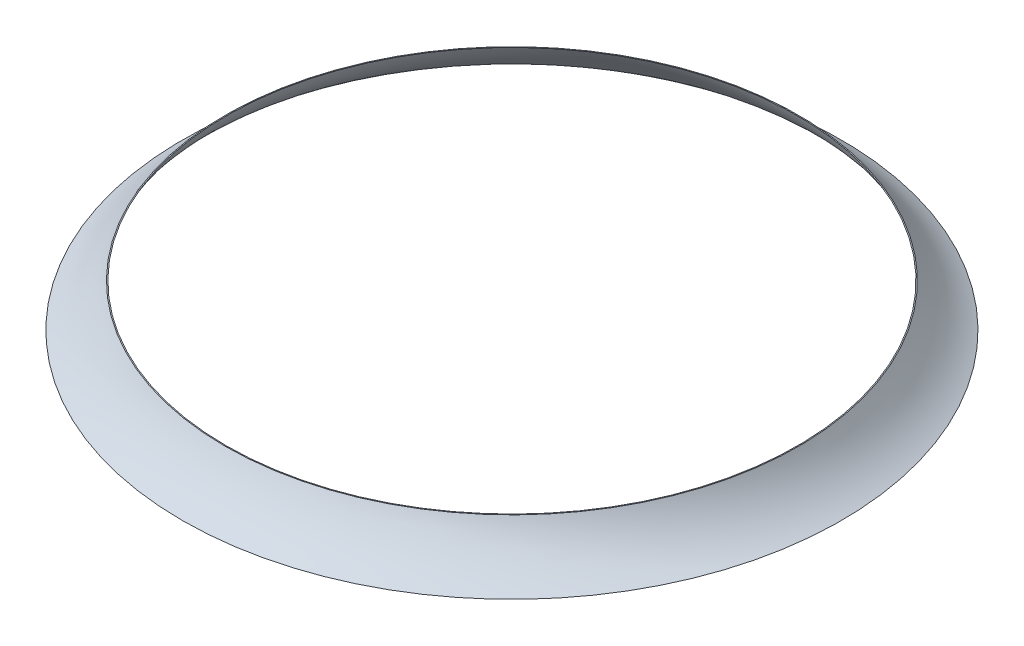
ISO-10303-21;
HEADER;
FILE_DESCRIPTION(('STEP AP214'),'2;1');
FILE_NAME('part.step','',(''),(''),'','','');
FILE_SCHEMA(('AUTOMOTIVE_DESIGN { 1 0 10303 214 1 1 1 1 }'));
ENDSEC;
DATA;
#1=APPLICATION_CONTEXT('core data for automotive mechanical design processes');
#2=APPLICATION_PROTOCOL_DEFINITION('international standard','automotive_design',2000,#1);
#3=PRODUCT_CONTEXT('',#1,'mechanical');
#4=PRODUCT('Part','Part','',(#3));
#5=PRODUCT_RELATED_PRODUCT_CATEGORY('part','',(#4));
#6=PRODUCT_DEFINITION_FORMATION('','',#4);
#7=PRODUCT_DEFINITION_CONTEXT('part definition',#1,'design');
#8=PRODUCT_DEFINITION('design','',#6,#7);
#9=PRODUCT_DEFINITION_SHAPE('','',#8);
#10=(LENGTH_UNIT() NAMED_UNIT(*) SI_UNIT(.MILLI.,.METRE.));
#11=(NAMED_UNIT(*) PLANE_ANGLE_UNIT() SI_UNIT($,.RADIAN.));
#12=(NAMED_UNIT(*) SI_UNIT($,.STERADIAN.) SOLID_ANGLE_UNIT());
#13=UNCERTAINTY_MEASURE_WITH_UNIT(LENGTH_MEASURE(1.E-05),#10,'distance_accuracy_value','');
#14=(GEOMETRIC_REPRESENTATION_CONTEXT(3) GLOBAL_UNCERTAINTY_ASSIGNED_CONTEXT((#13)) GLOBAL_UNIT_ASSIGNED_CONTEXT((#10,
#11,#12)) REPRESENTATION_CONTEXT('',''));
#15=CARTESIAN_POINT('',(0.,0.,0.));
#16=DIRECTION('',(0.,0.,1.));
#17=DIRECTION('',(1.,0.,0.));
#18=AXIS2_PLACEMENT_3D('',#15,#16,#17);
#19=CARTESIAN_POINT('',(0.,1309.47656172527,0.));
#20=DIRECTION('',(0.,-1.,0.));
#21=DIRECTION('',(0.,0.,-1.));
#22=AXIS2_PLACEMENT_3D('',#19,#20,#21);
#23=PLANE('',#22);
#24=CARTESIAN_POINT('',(0.,1309.47656172527,-1213.3632113717));
#25=DIRECTION('',(0.,1.,0.));
#26=DIRECTION('',(0.,0.,1.));
#27=AXIS2_PLACEMENT_3D('',#24,#25,#26);
#28=CIRCLE('',#27,800.20649659805);
#29=CARTESIAN_POINT('',(0.,1309.47656172527,-413.156714773655));
#30=VERTEX_POINT('',#29);
#31=EDGE_CURVE('E10',#30,#30,#28,.T.);
#32=ORIENTED_EDGE('',*,*,#31,.F.);
#33=EDGE_LOOP('',(#32));
#34=FACE_BOUND('',#33,.T.);
#35=CARTESIAN_POINT('',(0.,1309.47656172527,-1213.3632113717));
#36=DIRECTION('',(0.,1.,0.));
#37=DIRECTION('',(0.,0.,1.));
#38=AXIS2_PLACEMENT_3D('',#35,#36,#37);
#39=CIRCLE('',#38,803.);
#40=CARTESIAN_POINT('',(0.,1309.47656172527,-410.363211371705));
#41=VERTEX_POINT('',#40);
#42=EDGE_CURVE('E47',#41,#41,#39,.T.);
#43=ORIENTED_EDGE('',*,*,#42,.T.);
#44=EDGE_LOOP('',(#43));
#45=FACE_BOUND('',#44,.T.);
#46=ADVANCED_FACE('F33',(#34,#45),#23,.F.);
#47=CARTESIAN_POINT('',(0.,1430.18435650638,-1213.3632113717));
#48=DIRECTION('',(0.,1.,0.));
#49=DIRECTION('',(0.,0.,1.));
#50=AXIS2_PLACEMENT_3D('',#47,#48,#49);
#51=TOROIDAL_SURFACE('',#50,1043.70779478111,271.777949690095);
#52=CARTESIAN_POINT('',(0.,1189.47656172527,-1213.3632113717));
#53=DIRECTION('',(0.,1.,0.));
#54=DIRECTION('',(0.,0.,1.));
#55=AXIS2_PLACEMENT_3D('',#52,#53,#54);
#56=CIRCLE('',#55,917.521379231063);
#57=CARTESIAN_POINT('',(0.,1189.47656172527,-295.841832140642));
#58=VERTEX_POINT('',#57);
#59=EDGE_CURVE('E39',#58,#58,#56,.T.);
#60=ORIENTED_EDGE('',*,*,#59,.F.);
#61=EDGE_LOOP('',(#60));
#62=FACE_BOUND('',#61,.T.);
#63=ORIENTED_EDGE('',*,*,#31,.T.);
#64=EDGE_LOOP('',(#63));
#65=FACE_BOUND('',#64,.T.);
#66=ADVANCED_FACE('F62',(#62,#65),#51,.T.);
#67=CARTESIAN_POINT('',(0.,1189.47656172527,0.));
#68=DIRECTION('',(0.,-1.,0.));
#69=DIRECTION('',(0.,0.,-1.));
#70=AXIS2_PLACEMENT_3D('',#67,#68,#69);
#71=PLANE('',#70);
#72=ORIENTED_EDGE('',*,*,#59,.T.);
#73=EDGE_LOOP('',(#72));
#74=FACE_BOUND('',#73,.T.);
#75=CARTESIAN_POINT('',(0.,1189.47656172527,-1213.3632113717));
#76=DIRECTION('',(0.,1.,0.));
#77=DIRECTION('',(0.,0.,1.));
#78=AXIS2_PLACEMENT_3D('',#75,#76,#77);
#79=CIRCLE('',#78,923.);
#80=CARTESIAN_POINT('',(0.,1189.47656172527,-290.363211371705));
#81=VERTEX_POINT('',#80);
#82=EDGE_CURVE('E43',#81,#81,#79,.T.);
#83=ORIENTED_EDGE('',*,*,#82,.F.);
#84=EDGE_LOOP('',(#83));
#85=FACE_BOUND('',#84,.T.);
#86=ADVANCED_FACE('F56',(#74,#85),#71,.T.);
#87=CARTESIAN_POINT('',(0.,1430.18435650638,-1213.3632113717));
#88=DIRECTION('',(0.,1.,0.));
#89=DIRECTION('',(0.,0.,1.));
#90=AXIS2_PLACEMENT_3D('',#87,#88,#89);
#91=TOROIDAL_SURFACE('',#90,1043.70779478111,269.277949690095);
#92=ORIENTED_EDGE('',*,*,#82,.T.);
#93=EDGE_LOOP('',(#92));
#94=FACE_BOUND('',#93,.T.);
#95=ORIENTED_EDGE('',*,*,#42,.F.);
#96=EDGE_LOOP('',(#95));
#97=FACE_BOUND('',#96,.T.);
#98=ADVANCED_FACE('F54',(#94,#97),#91,.F.);
#99=CLOSED_SHELL('',(#46,#66,#86,#98));
#100=MANIFOLD_SOLID_BREP('B2',#99);
#101=ADVANCED_BREP_SHAPE_REPRESENTATION('',(#18,#100),#14);
#102=SHAPE_DEFINITION_REPRESENTATION(#9,#101);
ENDSEC;
END-ISO-10303-21;
